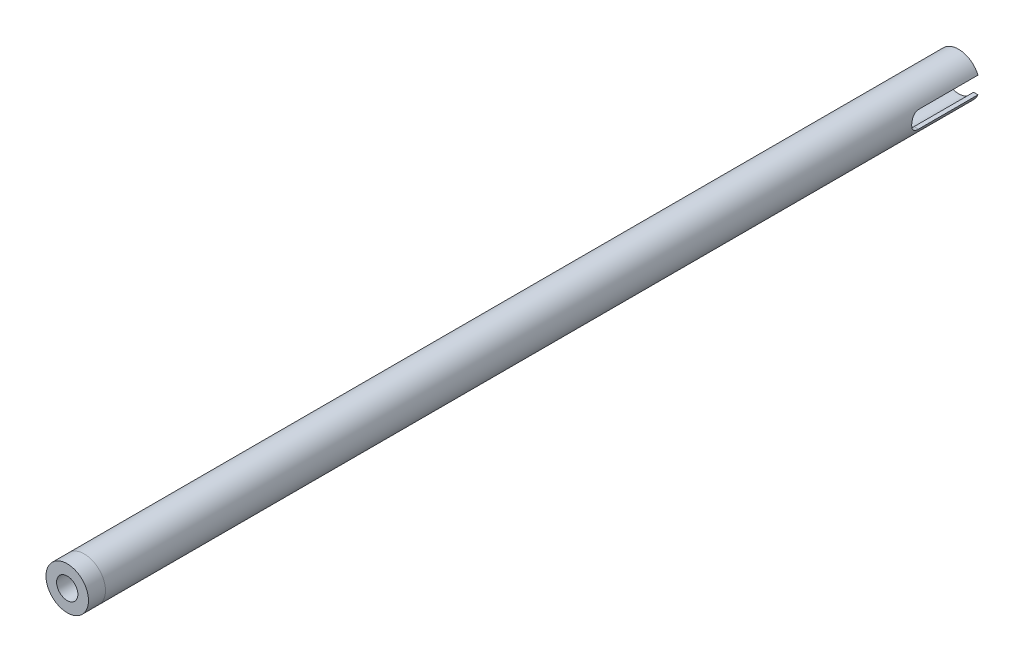
ISO-10303-21;
HEADER;
FILE_DESCRIPTION(('STEP AP214'),'2;1');
FILE_NAME('part.step','',(''),(''),'','','');
FILE_SCHEMA(('AUTOMOTIVE_DESIGN { 1 0 10303 214 1 1 1 1 }'));
ENDSEC;
DATA;
#1=APPLICATION_CONTEXT('core data for automotive mechanical design processes');
#2=APPLICATION_PROTOCOL_DEFINITION('international standard','automotive_design',2000,#1);
#3=PRODUCT_CONTEXT('',#1,'mechanical');
#4=PRODUCT('Part','Part','',(#3));
#5=PRODUCT_RELATED_PRODUCT_CATEGORY('part','',(#4));
#6=PRODUCT_DEFINITION_FORMATION('','',#4);
#7=PRODUCT_DEFINITION_CONTEXT('part definition',#1,'design');
#8=PRODUCT_DEFINITION('design','',#6,#7);
#9=PRODUCT_DEFINITION_SHAPE('','',#8);
#10=(LENGTH_UNIT() NAMED_UNIT(*) SI_UNIT(.MILLI.,.METRE.));
#11=(NAMED_UNIT(*) PLANE_ANGLE_UNIT() SI_UNIT($,.RADIAN.));
#12=(NAMED_UNIT(*) SI_UNIT($,.STERADIAN.) SOLID_ANGLE_UNIT());
#13=UNCERTAINTY_MEASURE_WITH_UNIT(LENGTH_MEASURE(1.E-05),#10,'distance_accuracy_value','');
#14=(GEOMETRIC_REPRESENTATION_CONTEXT(3) GLOBAL_UNCERTAINTY_ASSIGNED_CONTEXT((#13)) GLOBAL_UNIT_ASSIGNED_CONTEXT((#10,
#11,#12)) REPRESENTATION_CONTEXT('',''));
#15=CARTESIAN_POINT('',(0.,0.,0.));
#16=DIRECTION('',(0.,0.,1.));
#17=DIRECTION('',(1.,0.,0.));
#18=AXIS2_PLACEMENT_3D('',#15,#16,#17);
#19=CARTESIAN_POINT('',(0.,0.,-332.661725369318));
#20=DIRECTION('',(0.,0.,1.));
#21=DIRECTION('',(1.,0.,0.));
#22=AXIS2_PLACEMENT_3D('',#19,#20,#21);
#23=CYLINDRICAL_SURFACE('',#22,7.9375);
#24=CARTESIAN_POINT('',(0.,0.,-6.35));
#25=DIRECTION('',(0.,0.,1.));
#26=DIRECTION('',(1.,0.,0.));
#27=AXIS2_PLACEMENT_3D('',#24,#25,#26);
#28=CIRCLE('',#27,7.9375);
#29=CARTESIAN_POINT('',(7.9375,0.,-6.35));
#30=VERTEX_POINT('',#29);
#31=EDGE_CURVE('E167',#30,#30,#28,.T.);
#32=ORIENTED_EDGE('',*,*,#31,.F.);
#33=EDGE_LOOP('',(#32));
#34=FACE_BOUND('',#33,.T.);
#35=CARTESIAN_POINT('',(-7.2748389157424,3.175,-310.436725369318));
#36=CARTESIAN_POINT('',(-7.27482137043434,3.17501267173453,-310.351305253836));
#37=CARTESIAN_POINT('',(-7.27634297592672,3.17155313247793,-310.265894724273));
#38=CARTESIAN_POINT('',(-7.28233338484875,3.15778866907725,-310.095762719945));
#39=CARTESIAN_POINT('',(-7.28680106535325,3.14748635311323,-310.011040995086));
#40=CARTESIAN_POINT('',(-7.2985291631267,3.12019002880163,-309.843227295277));
#41=CARTESIAN_POINT('',(-7.30577831906487,3.10322299732752,-309.760130150518));
#42=CARTESIAN_POINT('',(-7.32282161153744,3.06278779397035,-309.595819048493));
#43=CARTESIAN_POINT('',(-7.33261590324725,3.03931922568674,-309.514605206379));
#44=CARTESIAN_POINT('',(-7.36535331460444,2.95952924342962,-309.274780383796));
#45=CARTESIAN_POINT('',(-7.39167595677839,2.89376893609239,-309.119655454993));
#46=CARTESIAN_POINT('',(-7.45033259991547,2.73920602658923,-308.822568028282));
#47=CARTESIAN_POINT('',(-7.48267254395243,2.65038060922872,-308.680618753064));
#48=CARTESIAN_POINT('',(-7.55175295441386,2.44684429809695,-308.405897983544));
#49=CARTESIAN_POINT('',(-7.58863404630154,2.33103943595689,-308.273970599032));
#50=CARTESIAN_POINT('',(-7.66147718953598,2.07914562663536,-308.0308077154));
#51=CARTESIAN_POINT('',(-7.69743902899202,1.94305205135848,-307.919576950473));
#52=CARTESIAN_POINT('',(-7.76611692840651,1.64778282664419,-307.716655750977));
#53=CARTESIAN_POINT('',(-7.79864638434712,1.48790317306356,-307.625921339573));
#54=CARTESIAN_POINT('',(-7.85502980346525,1.15369615984563,-307.473063786156));
#55=CARTESIAN_POINT('',(-7.87889360585224,0.979385463602722,-307.410908173538));
#56=CARTESIAN_POINT('',(-7.91022225039827,0.670405323433354,-307.330396529882));
#57=CARTESIAN_POINT('',(-7.92038443902171,0.537888188660439,-307.304718606473));
#58=CARTESIAN_POINT('',(-7.93061686811603,0.337231082382107,-307.278963523391));
#59=CARTESIAN_POINT('',(-7.93319257341971,0.269991647180298,-307.272505426111));
#60=CARTESIAN_POINT('',(-7.93663621925193,0.135173873369596,-307.263884408359));
#61=CARTESIAN_POINT('',(-7.93750363389236,0.0675954368175869,-307.261722810541));
#62=CARTESIAN_POINT('',(-7.9375,0.,-307.261725369318));
#63=B_SPLINE_CURVE_WITH_KNOTS('',3,(#35,#36,#37,#38,#39,#40,#41,#42,#43,#44,#45,#46,#47,#48,#49,
#50,#51,#52,#53,#54,#55,#56,#57,#58,#59,#60,#61,#62),.UNSPECIFIED.,.F.,.F.,(4,2,2,2,2,2,2,2,2,2,
2,2,2,4),(0.,0.256160797396612,0.512224013007058,0.767261264672238,1.02231406945471,
1.53142416248594,2.04103978047897,2.57679273649398,3.11266809162683,3.66991136029742,
4.22651992730645,4.63134321412666,4.8339937586662,5.03670667834028),.UNSPECIFIED.);
#64=CARTESIAN_POINT('',(-7.2748389157424,3.175,-310.436725369318));
#65=VERTEX_POINT('',#64);
#66=CARTESIAN_POINT('',(-7.9375,0.,-307.261725369318));
#67=VERTEX_POINT('',#66);
#68=EDGE_CURVE('E194',#65,#67,#63,.T.);
#69=ORIENTED_EDGE('',*,*,#68,.T.);
#70=CARTESIAN_POINT('',(-7.9375,0.,-307.261725369318));
#71=CARTESIAN_POINT('',(-7.93751279435796,-0.0856973243893185,-307.261713339149));
#72=CARTESIAN_POINT('',(-7.93611246860092,-0.171386675169291,-307.265194706621));
#73=CARTESIAN_POINT('',(-7.93058107051394,-0.342092796869088,-307.279050801956));
#74=CARTESIAN_POINT('',(-7.92645080745519,-0.427109759557717,-307.289423486939));
#75=CARTESIAN_POINT('',(-7.91557399086504,-0.595570690948319,-307.316920681006));
#76=CARTESIAN_POINT('',(-7.90883664469869,-0.67901912358001,-307.334021432279));
#77=CARTESIAN_POINT('',(-7.89293284658536,-0.844038966454646,-307.374788679753));
#78=CARTESIAN_POINT('',(-7.88376629739099,-0.925610301410303,-307.398455438809));
#79=CARTESIAN_POINT('',(-7.85297007832481,-1.16656173687588,-307.478963094508));
#80=CARTESIAN_POINT('',(-7.82802544143958,-1.32244720282989,-307.545355727385));
#81=CARTESIAN_POINT('',(-7.77174407779742,-1.62081902572888,-307.701401131378));
#82=CARTESIAN_POINT('',(-7.74040257287306,-1.7632952496653,-307.791071303441));
#83=CARTESIAN_POINT('',(-7.67287736621953,-2.03755465224644,-307.995524910956));
#84=CARTESIAN_POINT('',(-7.63654472176442,-2.16862853615059,-308.111211767688));
#85=CARTESIAN_POINT('',(-7.56380976030912,-2.41011022612819,-308.362505869397));
#86=CARTESIAN_POINT('',(-7.52740741976911,-2.52050895891189,-308.498121813879));
#87=CARTESIAN_POINT('',(-7.45683282624284,-2.72240939900242,-308.792820308746));
#88=CARTESIAN_POINT('',(-7.4228346735038,-2.81283701743189,-308.952684298661));
#89=CARTESIAN_POINT('',(-7.3633362219632,-2.96511894168388,-309.286810263457));
#90=CARTESIAN_POINT('',(-7.33782422493328,-3.02701262758154,-309.461052001217));
#91=CARTESIAN_POINT('',(-7.30424985403508,-3.10695047193342,-309.769355725868));
#92=CARTESIAN_POINT('',(-7.29331360019113,-3.13238569878909,-309.901214486754));
#93=CARTESIAN_POINT('',(-7.28227977674291,-3.15790858319001,-310.100931368448));
#94=CARTESIAN_POINT('',(-7.27949685702346,-3.16431127275807,-310.167879659208));
#95=CARTESIAN_POINT('',(-7.27577355567174,-3.17285909036155,-310.302121217074));
#96=CARTESIAN_POINT('',(-7.27483380475762,-3.1750027609968,-310.369414594372));
#97=CARTESIAN_POINT('',(-7.2748389157424,-3.175,-310.436725369318));
#98=B_SPLINE_CURVE_WITH_KNOTS('',3,(#70,#71,#72,#73,#74,#75,#76,#77,#78,#79,#80,#81,#82,#83,#84,
#85,#86,#87,#88,#89,#90,#91,#92,#93,#94,#95,#96,#97),.UNSPECIFIED.,.F.,.F.,(4,2,2,2,2,2,2,2,2,2,
2,2,2,4),(0.,0.256996432008007,0.513916713336978,0.769937797705386,1.02596913282157,
1.53722547809954,2.04886511530059,2.58219314099272,3.11575467201799,3.67332953074261,
4.2301325519037,4.63306130520181,4.8348500382744,5.03670780985612),.UNSPECIFIED.);
#99=CARTESIAN_POINT('',(-7.2748389157424,-3.175,-310.436725369318));
#100=VERTEX_POINT('',#99);
#101=EDGE_CURVE('E146',#67,#100,#98,.T.);
#102=ORIENTED_EDGE('',*,*,#101,.T.);
#103=DIRECTION('',(0.,0.,-1.));
#104=VECTOR('',#103,1.);
#105=CARTESIAN_POINT('',(-7.2748389157424,-3.175,-307.261725369318));
#106=LINE('',#105,#104);
#107=CARTESIAN_POINT('',(-7.2748389157424,-3.175,-332.661725369318));
#108=VERTEX_POINT('',#107);
#109=EDGE_CURVE('E141',#100,#108,#106,.T.);
#110=ORIENTED_EDGE('',*,*,#109,.T.);
#111=CARTESIAN_POINT('',(0.,0.,-332.661725369318));
#112=DIRECTION('',(0.,0.,1.));
#113=DIRECTION('',(1.,0.,0.));
#114=AXIS2_PLACEMENT_3D('',#111,#112,#113);
#115=CIRCLE('',#114,7.9375);
#116=CARTESIAN_POINT('',(7.2748389157424,-3.175,-332.661725369318));
#117=VERTEX_POINT('',#116);
#118=EDGE_CURVE('E144',#108,#117,#115,.T.);
#119=ORIENTED_EDGE('',*,*,#118,.T.);
#120=DIRECTION('',(0.,0.,-1.));
#121=VECTOR('',#120,1.);
#122=CARTESIAN_POINT('',(7.2748389157424,-3.175,-307.261725369318));
#123=LINE('',#122,#121);
#124=CARTESIAN_POINT('',(7.2748389157424,-3.175,-310.436725369318));
#125=VERTEX_POINT('',#124);
#126=EDGE_CURVE('E427',#125,#117,#123,.T.);
#127=ORIENTED_EDGE('',*,*,#126,.F.);
#128=CARTESIAN_POINT('',(7.2748389157424,-3.175,-310.436725369318));
#129=CARTESIAN_POINT('',(7.27482137043434,-3.17501267173453,-310.351305253836));
#130=CARTESIAN_POINT('',(7.27634297592672,-3.17155313247793,-310.265894724273));
#131=CARTESIAN_POINT('',(7.28233338484875,-3.15778866907725,-310.095762719945));
#132=CARTESIAN_POINT('',(7.28680106535325,-3.14748635311323,-310.011040995086));
#133=CARTESIAN_POINT('',(7.2985291631267,-3.12019002880163,-309.843227295277));
#134=CARTESIAN_POINT('',(7.30577831906487,-3.10322299732752,-309.760130150518));
#135=CARTESIAN_POINT('',(7.32282161153744,-3.06278779397035,-309.595819048493));
#136=CARTESIAN_POINT('',(7.33261590324725,-3.03931922568674,-309.514605206379));
#137=CARTESIAN_POINT('',(7.36535331460444,-2.95952924342962,-309.274780383796));
#138=CARTESIAN_POINT('',(7.39167595677839,-2.89376893609239,-309.119655454993));
#139=CARTESIAN_POINT('',(7.45033259991547,-2.73920602658923,-308.822568028282));
#140=CARTESIAN_POINT('',(7.48267254395243,-2.65038060922872,-308.680618753064));
#141=CARTESIAN_POINT('',(7.55175295441386,-2.44684429809695,-308.405897983544));
#142=CARTESIAN_POINT('',(7.58863404630154,-2.33103943595689,-308.273970599032));
#143=CARTESIAN_POINT('',(7.66147718953598,-2.07914562663536,-308.0308077154));
#144=CARTESIAN_POINT('',(7.69743902899202,-1.94305205135848,-307.919576950473));
#145=CARTESIAN_POINT('',(7.76611692840651,-1.64778282664419,-307.716655750977));
#146=CARTESIAN_POINT('',(7.79864638434712,-1.48790317306356,-307.625921339573));
#147=CARTESIAN_POINT('',(7.85502980346525,-1.15369615984563,-307.473063786156));
#148=CARTESIAN_POINT('',(7.87889360585224,-0.979385463602722,-307.410908173538));
#149=CARTESIAN_POINT('',(7.91022225039827,-0.670405323433354,-307.330396529882));
#150=CARTESIAN_POINT('',(7.92038443902171,-0.537888188660439,-307.304718606473));
#151=CARTESIAN_POINT('',(7.93061686811603,-0.337231082382107,-307.278963523391));
#152=CARTESIAN_POINT('',(7.93319257341971,-0.269991647180298,-307.272505426111));
#153=CARTESIAN_POINT('',(7.93663621925193,-0.135173873369596,-307.263884408359));
#154=CARTESIAN_POINT('',(7.93750363389236,-0.0675954368175869,-307.261722810541));
#155=CARTESIAN_POINT('',(7.9375,0.,-307.261725369318));
#156=B_SPLINE_CURVE_WITH_KNOTS('',3,(#128,#129,#130,#131,#132,#133,#134,#135,#136,#137,#138,
#139,#140,#141,#142,#143,#144,#145,#146,#147,#148,#149,#150,#151,#152,#153,#154,#155),
.UNSPECIFIED.,.F.,.F.,(4,2,2,2,2,2,2,2,2,2,2,2,2,4),(0.,0.256160797396612,0.512224013007058,
0.767261264672238,1.02231406945471,1.53142416248594,2.04103978047897,2.57679273649398,
3.11266809162683,3.66991136029742,4.22651992730645,4.63134321412666,4.8339937586662,
5.03670667834028),.UNSPECIFIED.);
#157=CARTESIAN_POINT('',(7.9375,0.,-307.261725369318));
#158=VERTEX_POINT('',#157);
#159=EDGE_CURVE('E87',#125,#158,#156,.T.);
#160=ORIENTED_EDGE('',*,*,#159,.T.);
#161=CARTESIAN_POINT('',(7.9375,0.,-307.261725369318));
#162=CARTESIAN_POINT('',(7.93751279435796,0.0856973243893185,-307.261713339149));
#163=CARTESIAN_POINT('',(7.93611246860092,0.171386675169291,-307.265194706621));
#164=CARTESIAN_POINT('',(7.93058107051394,0.342092796869088,-307.279050801956));
#165=CARTESIAN_POINT('',(7.92645080745519,0.427109759557717,-307.289423486939));
#166=CARTESIAN_POINT('',(7.91557399086504,0.595570690948319,-307.316920681006));
#167=CARTESIAN_POINT('',(7.90883664469869,0.67901912358001,-307.334021432279));
#168=CARTESIAN_POINT('',(7.89293284658536,0.844038966454646,-307.374788679753));
#169=CARTESIAN_POINT('',(7.88376629739099,0.925610301410303,-307.398455438809));
#170=CARTESIAN_POINT('',(7.85297007832481,1.16656173687588,-307.478963094508));
#171=CARTESIAN_POINT('',(7.82802544143958,1.32244720282989,-307.545355727385));
#172=CARTESIAN_POINT('',(7.77174407779742,1.62081902572888,-307.701401131378));
#173=CARTESIAN_POINT('',(7.74040257287306,1.7632952496653,-307.791071303441));
#174=CARTESIAN_POINT('',(7.67287736621953,2.03755465224644,-307.995524910956));
#175=CARTESIAN_POINT('',(7.63654472176442,2.16862853615059,-308.111211767688));
#176=CARTESIAN_POINT('',(7.56380976030912,2.41011022612819,-308.362505869397));
#177=CARTESIAN_POINT('',(7.52740741976911,2.52050895891189,-308.498121813879));
#178=CARTESIAN_POINT('',(7.45683282624284,2.72240939900242,-308.792820308746));
#179=CARTESIAN_POINT('',(7.4228346735038,2.81283701743189,-308.952684298661));
#180=CARTESIAN_POINT('',(7.3633362219632,2.96511894168388,-309.286810263457));
#181=CARTESIAN_POINT('',(7.33782422493328,3.02701262758154,-309.461052001217));
#182=CARTESIAN_POINT('',(7.30424985403508,3.10695047193342,-309.769355725868));
#183=CARTESIAN_POINT('',(7.29331360019113,3.13238569878909,-309.901214486754));
#184=CARTESIAN_POINT('',(7.28227977674291,3.15790858319001,-310.100931368448));
#185=CARTESIAN_POINT('',(7.27949685702346,3.16431127275807,-310.167879659208));
#186=CARTESIAN_POINT('',(7.27577355567174,3.17285909036155,-310.302121217074));
#187=CARTESIAN_POINT('',(7.27483380475762,3.1750027609968,-310.369414594372));
#188=CARTESIAN_POINT('',(7.2748389157424,3.175,-310.436725369318));
#189=B_SPLINE_CURVE_WITH_KNOTS('',3,(#161,#162,#163,#164,#165,#166,#167,#168,#169,#170,#171,
#172,#173,#174,#175,#176,#177,#178,#179,#180,#181,#182,#183,#184,#185,#186,#187,#188),
.UNSPECIFIED.,.F.,.F.,(4,2,2,2,2,2,2,2,2,2,2,2,2,4),(0.,0.256996432008007,0.513916713336978,
0.769937797705386,1.02596913282157,1.53722547809954,2.04886511530059,2.58219314099272,
3.11575467201799,3.67332953074261,4.2301325519037,4.63306130520181,4.8348500382744,
5.03670780985612),.UNSPECIFIED.);
#190=CARTESIAN_POINT('',(7.2748389157424,3.175,-310.436725369318));
#191=VERTEX_POINT('',#190);
#192=EDGE_CURVE('E73',#158,#191,#189,.T.);
#193=ORIENTED_EDGE('',*,*,#192,.T.);
#194=DIRECTION('',(0.,0.,-1.));
#195=VECTOR('',#194,1.);
#196=CARTESIAN_POINT('',(7.2748389157424,3.175,-307.261725369318));
#197=LINE('',#196,#195);
#198=CARTESIAN_POINT('',(7.2748389157424,3.175,-332.661725369318));
#199=VERTEX_POINT('',#198);
#200=EDGE_CURVE('E160',#191,#199,#197,.T.);
#201=ORIENTED_EDGE('',*,*,#200,.T.);
#202=CARTESIAN_POINT('',(-7.2748389157424,3.175,-332.661725369318));
#203=VERTEX_POINT('',#202);
#204=EDGE_CURVE('E166',#199,#203,#115,.T.);
#205=ORIENTED_EDGE('',*,*,#204,.T.);
#206=DIRECTION('',(0.,0.,-1.));
#207=VECTOR('',#206,1.);
#208=CARTESIAN_POINT('',(-7.2748389157424,3.175,-307.261725369318));
#209=LINE('',#208,#207);
#210=EDGE_CURVE('E420',#65,#203,#209,.T.);
#211=ORIENTED_EDGE('',*,*,#210,.F.);
#212=EDGE_LOOP('',(#69,#102,#110,#119,#127,#160,#193,#201,#205,#211));
#213=FACE_BOUND('',#212,.T.);
#214=ADVANCED_FACE('F63',(#34,#213),#23,.T.);
#215=CARTESIAN_POINT('',(0.,0.,-332.661725369318));
#216=DIRECTION('',(0.,0.,1.));
#217=DIRECTION('',(1.,0.,0.));
#218=AXIS2_PLACEMENT_3D('',#215,#216,#217);
#219=PLANE('',#218);
#220=DIRECTION('',(1.,0.,0.));
#221=VECTOR('',#220,1.);
#222=CARTESIAN_POINT('',(0.,-3.175,-332.661725369318));
#223=LINE('',#222,#221);
#224=CARTESIAN_POINT('',(-5.63085690548073,-3.175,-332.661725369318));
#225=VERTEX_POINT('',#224);
#226=EDGE_CURVE('E153',#108,#225,#223,.T.);
#227=ORIENTED_EDGE('',*,*,#226,.T.);
#228=CARTESIAN_POINT('',(0.,0.,-332.661725369318));
#229=DIRECTION('',(0.,0.,1.));
#230=DIRECTION('',(1.,0.,0.));
#231=AXIS2_PLACEMENT_3D('',#228,#229,#230);
#232=CIRCLE('',#231,6.4643);
#233=CARTESIAN_POINT('',(5.63085690548073,-3.175,-332.661725369318));
#234=VERTEX_POINT('',#233);
#235=EDGE_CURVE('E275',#225,#234,#232,.T.);
#236=ORIENTED_EDGE('',*,*,#235,.T.);
#237=DIRECTION('',(1.,0.,0.));
#238=VECTOR('',#237,1.);
#239=CARTESIAN_POINT('',(0.,-3.175,-332.661725369318));
#240=LINE('',#239,#238);
#241=EDGE_CURVE('E165',#234,#117,#240,.T.);
#242=ORIENTED_EDGE('',*,*,#241,.T.);
#243=ORIENTED_EDGE('',*,*,#118,.F.);
#244=EDGE_LOOP('',(#227,#236,#242,#243));
#245=FACE_BOUND('',#244,.T.);
#246=ADVANCED_FACE('F163',(#245),#219,.F.);
#247=CARTESIAN_POINT('',(0.,0.,-332.661725369318));
#248=DIRECTION('',(0.,0.,1.));
#249=DIRECTION('',(1.,0.,0.));
#250=AXIS2_PLACEMENT_3D('',#247,#248,#249);
#251=CYLINDRICAL_SURFACE('',#250,6.4643);
#252=CARTESIAN_POINT('',(0.,0.,-6.35));
#253=DIRECTION('',(0.,0.,1.));
#254=DIRECTION('',(1.,0.,0.));
#255=AXIS2_PLACEMENT_3D('',#252,#253,#254);
#256=CIRCLE('',#255,6.4643);
#257=CARTESIAN_POINT('',(6.4643,0.,-6.35));
#258=VERTEX_POINT('',#257);
#259=EDGE_CURVE('E149',#258,#258,#256,.T.);
#260=ORIENTED_EDGE('',*,*,#259,.T.);
#261=EDGE_LOOP('',(#260));
#262=FACE_BOUND('',#261,.T.);
#263=DIRECTION('',(0.,0.,-1.));
#264=VECTOR('',#263,1.);
#265=CARTESIAN_POINT('',(-5.63085690548073,-3.175,-307.261725369318));
#266=LINE('',#265,#264);
#267=CARTESIAN_POINT('',(-5.63085690548073,-3.175,-310.436725369318));
#268=VERTEX_POINT('',#267);
#269=EDGE_CURVE('E150',#268,#225,#266,.T.);
#270=ORIENTED_EDGE('',*,*,#269,.F.);
#271=CARTESIAN_POINT('',(-5.63085690548073,-3.175,-310.436725369318));
#272=CARTESIAN_POINT('',(-5.63083313994649,-3.17501475983035,-310.353348534598));
#273=CARTESIAN_POINT('',(-5.63270815771784,-3.17171623434453,-310.269984859429));
#274=CARTESIAN_POINT('',(-5.64007695954704,-3.15860868668088,-310.103979717333));
#275=CARTESIAN_POINT('',(-5.645568609108,-3.14880350463522,-310.021337853534));
#276=CARTESIAN_POINT('',(-5.65995160356269,-3.12287177657854,-309.857834588864));
#277=CARTESIAN_POINT('',(-5.66882360641349,-3.10678118209035,-309.776965776684));
#278=CARTESIAN_POINT('',(-5.68964253084949,-3.06848763641647,-309.617108396957));
#279=CARTESIAN_POINT('',(-5.70158978762268,-3.0462840189221,-309.538120035397));
#280=CARTESIAN_POINT('',(-5.74141867016874,-2.9709479042579,-309.305061789436));
#281=CARTESIAN_POINT('',(-5.77333273238342,-2.90901346570841,-309.154425248802));
#282=CARTESIAN_POINT('',(-5.84425759514897,-2.763754188191,-308.865570143967));
#283=CARTESIAN_POINT('',(-5.88327925344641,-2.68039654138926,-308.727371068904));
#284=CARTESIAN_POINT('',(-5.96775435279507,-2.48697819565355,-308.455430030665));
#285=CARTESIAN_POINT('',(-6.01347229172614,-2.37533204038057,-308.322895224316));
#286=CARTESIAN_POINT('',(-6.10404593063631,-2.13182339161096,-308.077519641238));
#287=CARTESIAN_POINT('',(-6.14890136897125,-1.99995486913048,-307.964684759259));
#288=CARTESIAN_POINT('',(-6.23619220514827,-1.70925564842441,-307.754701375339));
#289=CARTESIAN_POINT('',(-6.27828027392068,-1.54922894444793,-307.65905109961));
#290=CARTESIAN_POINT('',(-6.351789494002,-1.21302302470908,-307.496667194393));
#291=CARTESIAN_POINT('',(-6.3832266631188,-1.03686857473503,-307.429890100589));
#292=CARTESIAN_POINT('',(-6.42590822780063,-0.717171909263578,-307.340457453281));
#293=CARTESIAN_POINT('',(-6.4401838278065,-0.575906031157537,-307.311069208359));
#294=CARTESIAN_POINT('',(-6.45458743188517,-0.361448476439118,-307.281536488697));
#295=CARTESIAN_POINT('',(-6.45822048728408,-0.289432204318672,-307.274117043936));
#296=CARTESIAN_POINT('',(-6.46308007773031,-0.144952050292043,-307.264208571776));
#297=CARTESIAN_POINT('',(-6.46430565210199,-0.072488001271515,-307.26172151258));
#298=CARTESIAN_POINT('',(-6.4643,0.,-307.261725369318));
#299=B_SPLINE_CURVE_WITH_KNOTS('',3,(#271,#272,#273,#274,#275,#276,#277,#278,#279,#280,#281,
#282,#283,#284,#285,#286,#287,#288,#289,#290,#291,#292,#293,#294,#295,#296,#297,#298),
.UNSPECIFIED.,.F.,.F.,(4,2,2,2,2,2,2,2,2,2,2,2,2,4),(0.,0.250022608278555,0.499897788003946,
0.748364171658939,0.996857648438736,1.49241740389683,1.9887406369739,2.52413245916958,
3.05968421153491,3.63008006190818,4.19961425046545,4.63293550793411,4.85021333970384,
5.06757785591817),.UNSPECIFIED.);
#300=CARTESIAN_POINT('',(-6.4643,0.,-307.261725369318));
#301=VERTEX_POINT('',#300);
#302=EDGE_CURVE('E221',#268,#301,#299,.T.);
#303=ORIENTED_EDGE('',*,*,#302,.T.);
#304=CARTESIAN_POINT('',(-6.4643,0.,-307.261725369318));
#305=CARTESIAN_POINT('',(-6.46431471784482,0.0839947643435499,-307.261712025192));
#306=CARTESIAN_POINT('',(-6.46266329267846,0.167980128010398,-307.26505812456));
#307=CARTESIAN_POINT('',(-6.45613851930725,0.335267070847885,-307.278365578164));
#308=CARTESIAN_POINT('',(-6.45126643524264,0.418568905327645,-307.288324336872));
#309=CARTESIAN_POINT('',(-6.4384393661228,0.583520093709583,-307.314694379341));
#310=CARTESIAN_POINT('',(-6.43049830091841,0.665175181914776,-307.331076533589));
#311=CARTESIAN_POINT('',(-6.41174605062734,0.826621713408832,-307.370094073343));
#312=CARTESIAN_POINT('',(-6.40093469346325,0.906413044651103,-307.392729833763));
#313=CARTESIAN_POINT('',(-6.3645999533627,1.14200454475575,-307.469629397855));
#314=CARTESIAN_POINT('',(-6.33514826225986,1.29435730209625,-307.532940031038));
#315=CARTESIAN_POINT('',(-6.26847721301058,1.5861501237047,-307.681431530868));
#316=CARTESIAN_POINT('',(-6.23125016174678,1.7255772002446,-307.766634077234));
#317=CARTESIAN_POINT('',(-6.14993667819984,1.99664965861336,-307.962148023363));
#318=CARTESIAN_POINT('',(-6.10557667432164,2.12736555519219,-308.073634883014));
#319=CARTESIAN_POINT('',(-6.01591119010693,2.36910305567939,-308.316037306196));
#320=CARTESIAN_POINT('',(-5.97060501254448,2.4801095192896,-308.446967665182));
#321=CARTESIAN_POINT('',(-5.88028635793905,2.68759195973766,-308.736290003925));
#322=CARTESIAN_POINT('',(-5.83554983812279,2.78235777578918,-308.896004106578));
#323=CARTESIAN_POINT('',(-5.75613746809778,2.94315382396594,-309.231355351154));
#324=CARTESIAN_POINT('',(-5.72144095718824,3.00924320962384,-309.406958803008));
#325=CARTESIAN_POINT('',(-5.67404956693615,3.09744900867387,-309.724963104694));
#326=CARTESIAN_POINT('',(-5.65804978215016,3.12636521602239,-309.864987794636));
#327=CARTESIAN_POINT('',(-5.64184153899281,3.1554574998571,-310.077736093246));
#328=CARTESIAN_POINT('',(-5.63773701667688,3.16277482388528,-310.149245981351));
#329=CARTESIAN_POINT('',(-5.63223913004552,3.17254960488947,-310.292737043122));
#330=CARTESIAN_POINT('',(-5.6308471601211,3.17500456237039,-310.364718440103));
#331=CARTESIAN_POINT('',(-5.63085690548073,3.175,-310.436725369318));
#332=B_SPLINE_CURVE_WITH_KNOTS('',3,(#304,#305,#306,#307,#308,#309,#310,#311,#312,#313,#314,
#315,#316,#317,#318,#319,#320,#321,#322,#323,#324,#325,#326,#327,#328,#329,#330,#331),
.UNSPECIFIED.,.F.,.F.,(4,2,2,2,2,2,2,2,2,2,2,2,2,4),(0.,0.251885801688016,0.503672794384369,
0.754330922106977,1.00500408047846,1.50534146760879,2.00617626510683,2.53624961383851,
3.06672840649523,3.63692439554961,4.20593853113138,4.63586569132644,4.85167139809474,
5.06758801082739),.UNSPECIFIED.);
#333=CARTESIAN_POINT('',(-5.63085690548073,3.175,-310.436725369318));
#334=VERTEX_POINT('',#333);
#335=EDGE_CURVE('E186',#301,#334,#332,.T.);
#336=ORIENTED_EDGE('',*,*,#335,.T.);
#337=DIRECTION('',(0.,0.,-1.));
#338=VECTOR('',#337,1.);
#339=CARTESIAN_POINT('',(-5.63085690548073,3.175,-307.261725369318));
#340=LINE('',#339,#338);
#341=CARTESIAN_POINT('',(-5.63085690548073,3.175,-332.661725369318));
#342=VERTEX_POINT('',#341);
#343=EDGE_CURVE('E417',#334,#342,#340,.T.);
#344=ORIENTED_EDGE('',*,*,#343,.T.);
#345=CARTESIAN_POINT('',(5.63085690548073,3.175,-332.661725369318));
#346=VERTEX_POINT('',#345);
#347=EDGE_CURVE('E172',#346,#342,#232,.T.);
#348=ORIENTED_EDGE('',*,*,#347,.F.);
#349=DIRECTION('',(0.,0.,-1.));
#350=VECTOR('',#349,1.);
#351=CARTESIAN_POINT('',(5.63085690548073,3.175,-307.261725369318));
#352=LINE('',#351,#350);
#353=CARTESIAN_POINT('',(5.63085690548073,3.175,-310.436725369318));
#354=VERTEX_POINT('',#353);
#355=EDGE_CURVE('E269',#354,#346,#352,.T.);
#356=ORIENTED_EDGE('',*,*,#355,.F.);
#357=CARTESIAN_POINT('',(5.63085690548073,3.175,-310.436725369318));
#358=CARTESIAN_POINT('',(5.63083313994649,3.17501475983035,-310.353348534598));
#359=CARTESIAN_POINT('',(5.63270815771784,3.17171623434453,-310.269984859429));
#360=CARTESIAN_POINT('',(5.64007695954704,3.15860868668088,-310.103979717333));
#361=CARTESIAN_POINT('',(5.645568609108,3.14880350463522,-310.021337853534));
#362=CARTESIAN_POINT('',(5.65995160356269,3.12287177657854,-309.857834588864));
#363=CARTESIAN_POINT('',(5.66882360641349,3.10678118209035,-309.776965776684));
#364=CARTESIAN_POINT('',(5.68964253084949,3.06848763641647,-309.617108396957));
#365=CARTESIAN_POINT('',(5.70158978762268,3.0462840189221,-309.538120035397));
#366=CARTESIAN_POINT('',(5.74141867016874,2.9709479042579,-309.305061789436));
#367=CARTESIAN_POINT('',(5.77333273238342,2.90901346570841,-309.154425248802));
#368=CARTESIAN_POINT('',(5.84425759514897,2.763754188191,-308.865570143967));
#369=CARTESIAN_POINT('',(5.88327925344641,2.68039654138926,-308.727371068904));
#370=CARTESIAN_POINT('',(5.96775435279507,2.48697819565355,-308.455430030665));
#371=CARTESIAN_POINT('',(6.01347229172614,2.37533204038057,-308.322895224316));
#372=CARTESIAN_POINT('',(6.10404593063631,2.13182339161096,-308.077519641238));
#373=CARTESIAN_POINT('',(6.14890136897125,1.99995486913048,-307.964684759259));
#374=CARTESIAN_POINT('',(6.23619220514827,1.70925564842441,-307.754701375339));
#375=CARTESIAN_POINT('',(6.27828027392068,1.54922894444793,-307.65905109961));
#376=CARTESIAN_POINT('',(6.351789494002,1.21302302470908,-307.496667194393));
#377=CARTESIAN_POINT('',(6.3832266631188,1.03686857473503,-307.429890100589));
#378=CARTESIAN_POINT('',(6.42590822780063,0.717171909263578,-307.340457453281));
#379=CARTESIAN_POINT('',(6.4401838278065,0.575906031157537,-307.311069208359));
#380=CARTESIAN_POINT('',(6.45458743188517,0.361448476439118,-307.281536488697));
#381=CARTESIAN_POINT('',(6.45822048728408,0.289432204318672,-307.274117043936));
#382=CARTESIAN_POINT('',(6.46308007773031,0.144952050292043,-307.264208571776));
#383=CARTESIAN_POINT('',(6.46430565210199,0.072488001271515,-307.26172151258));
#384=CARTESIAN_POINT('',(6.4643,0.,-307.261725369318));
#385=B_SPLINE_CURVE_WITH_KNOTS('',3,(#357,#358,#359,#360,#361,#362,#363,#364,#365,#366,#367,
#368,#369,#370,#371,#372,#373,#374,#375,#376,#377,#378,#379,#380,#381,#382,#383,#384),
.UNSPECIFIED.,.F.,.F.,(4,2,2,2,2,2,2,2,2,2,2,2,2,4),(0.,0.250022608278555,0.499897788003946,
0.748364171658939,0.996857648438736,1.49241740389683,1.9887406369739,2.52413245916958,
3.05968421153491,3.63008006190818,4.19961425046545,4.63293550793411,4.85021333970384,
5.06757785591817),.UNSPECIFIED.);
#386=CARTESIAN_POINT('',(6.4643,0.,-307.261725369318));
#387=VERTEX_POINT('',#386);
#388=EDGE_CURVE('E13',#354,#387,#385,.T.);
#389=ORIENTED_EDGE('',*,*,#388,.T.);
#390=CARTESIAN_POINT('',(6.4643,0.,-307.261725369318));
#391=CARTESIAN_POINT('',(6.46431471784482,-0.0839947643435499,-307.261712025192));
#392=CARTESIAN_POINT('',(6.46266329267846,-0.167980128010398,-307.26505812456));
#393=CARTESIAN_POINT('',(6.45613851930725,-0.335267070847885,-307.278365578164));
#394=CARTESIAN_POINT('',(6.45126643524264,-0.418568905327645,-307.288324336872));
#395=CARTESIAN_POINT('',(6.4384393661228,-0.583520093709583,-307.314694379341));
#396=CARTESIAN_POINT('',(6.43049830091841,-0.665175181914776,-307.331076533589));
#397=CARTESIAN_POINT('',(6.41174605062734,-0.826621713408832,-307.370094073343));
#398=CARTESIAN_POINT('',(6.40093469346325,-0.906413044651103,-307.392729833763));
#399=CARTESIAN_POINT('',(6.3645999533627,-1.14200454475575,-307.469629397855));
#400=CARTESIAN_POINT('',(6.33514826225986,-1.29435730209625,-307.532940031038));
#401=CARTESIAN_POINT('',(6.26847721301058,-1.5861501237047,-307.681431530868));
#402=CARTESIAN_POINT('',(6.23125016174678,-1.7255772002446,-307.766634077234));
#403=CARTESIAN_POINT('',(6.14993667819984,-1.99664965861336,-307.962148023363));
#404=CARTESIAN_POINT('',(6.10557667432164,-2.12736555519219,-308.073634883014));
#405=CARTESIAN_POINT('',(6.01591119010693,-2.36910305567939,-308.316037306196));
#406=CARTESIAN_POINT('',(5.97060501254448,-2.4801095192896,-308.446967665182));
#407=CARTESIAN_POINT('',(5.88028635793905,-2.68759195973766,-308.736290003925));
#408=CARTESIAN_POINT('',(5.83554983812279,-2.78235777578918,-308.896004106578));
#409=CARTESIAN_POINT('',(5.75613746809778,-2.94315382396594,-309.231355351154));
#410=CARTESIAN_POINT('',(5.72144095718824,-3.00924320962384,-309.406958803008));
#411=CARTESIAN_POINT('',(5.67404956693615,-3.09744900867387,-309.724963104694));
#412=CARTESIAN_POINT('',(5.65804978215016,-3.12636521602239,-309.864987794636));
#413=CARTESIAN_POINT('',(5.64184153899281,-3.1554574998571,-310.077736093246));
#414=CARTESIAN_POINT('',(5.63773701667688,-3.16277482388528,-310.149245981351));
#415=CARTESIAN_POINT('',(5.63223913004552,-3.17254960488947,-310.292737043122));
#416=CARTESIAN_POINT('',(5.6308471601211,-3.17500456237039,-310.364718440103));
#417=CARTESIAN_POINT('',(5.63085690548073,-3.175,-310.436725369318));
#418=B_SPLINE_CURVE_WITH_KNOTS('',3,(#390,#391,#392,#393,#394,#395,#396,#397,#398,#399,#400,
#401,#402,#403,#404,#405,#406,#407,#408,#409,#410,#411,#412,#413,#414,#415,#416,#417),
.UNSPECIFIED.,.F.,.F.,(4,2,2,2,2,2,2,2,2,2,2,2,2,4),(0.,0.251885801688016,0.503672794384369,
0.754330922106977,1.00500408047846,1.50534146760879,2.00617626510683,2.53624961383851,
3.06672840649523,3.63692439554961,4.20593853113138,4.63586569132644,4.85167139809474,
5.06758801082739),.UNSPECIFIED.);
#419=CARTESIAN_POINT('',(5.63085690548073,-3.175,-310.436725369318));
#420=VERTEX_POINT('',#419);
#421=EDGE_CURVE('E237',#387,#420,#418,.T.);
#422=ORIENTED_EDGE('',*,*,#421,.T.);
#423=DIRECTION('',(0.,0.,-1.));
#424=VECTOR('',#423,1.);
#425=CARTESIAN_POINT('',(5.63085690548073,-3.175,-307.261725369318));
#426=LINE('',#425,#424);
#427=EDGE_CURVE('E271',#420,#234,#426,.T.);
#428=ORIENTED_EDGE('',*,*,#427,.T.);
#429=ORIENTED_EDGE('',*,*,#235,.F.);
#430=EDGE_LOOP('',(#270,#303,#336,#344,#348,#356,#389,#422,#428,#429));
#431=FACE_BOUND('',#430,.T.);
#432=ADVANCED_FACE('F201',(#262,#431),#251,.F.);
#433=ORIENTED_EDGE('',*,*,#347,.T.);
#434=DIRECTION('',(1.,0.,0.));
#435=VECTOR('',#434,1.);
#436=CARTESIAN_POINT('',(0.,3.175,-332.661725369318));
#437=LINE('',#436,#435);
#438=EDGE_CURVE('E159',#203,#342,#437,.T.);
#439=ORIENTED_EDGE('',*,*,#438,.F.);
#440=ORIENTED_EDGE('',*,*,#204,.F.);
#441=DIRECTION('',(1.,0.,0.));
#442=VECTOR('',#441,1.);
#443=CARTESIAN_POINT('',(0.,3.175,-332.661725369318));
#444=LINE('',#443,#442);
#445=EDGE_CURVE('E253',#346,#199,#444,.T.);
#446=ORIENTED_EDGE('',*,*,#445,.F.);
#447=EDGE_LOOP('',(#433,#439,#440,#446));
#448=FACE_BOUND('',#447,.T.);
#449=ADVANCED_FACE('F286',(#448),#219,.F.);
#450=CARTESIAN_POINT('',(0.,0.,-6.35));
#451=DIRECTION('',(0.,0.,1.));
#452=DIRECTION('',(1.,0.,0.));
#453=AXIS2_PLACEMENT_3D('',#450,#451,#452);
#454=PLANE('',#453);
#455=ORIENTED_EDGE('',*,*,#259,.F.);
#456=EDGE_LOOP('',(#455));
#457=FACE_BOUND('',#456,.T.);
#458=ORIENTED_EDGE('',*,*,#31,.T.);
#459=EDGE_LOOP('',(#458));
#460=FACE_BOUND('',#459,.T.);
#461=ADVANCED_FACE('F283',(#457,#460),#454,.T.);
#462=CARTESIAN_POINT('',(0.,3.175,-307.261725369318));
#463=DIRECTION('',(0.,1.,0.));
#464=DIRECTION('',(0.,0.,1.));
#465=AXIS2_PLACEMENT_3D('',#462,#463,#464);
#466=PLANE('',#465);
#467=ORIENTED_EDGE('',*,*,#200,.F.);
#468=DIRECTION('',(1.,0.,0.));
#469=VECTOR('',#468,1.);
#470=CARTESIAN_POINT('',(5.63085690548073,3.175,-310.436725369318));
#471=LINE('',#470,#469);
#472=EDGE_CURVE('E184',#191,#354,#471,.F.);
#473=ORIENTED_EDGE('',*,*,#472,.T.);
#474=ORIENTED_EDGE('',*,*,#355,.T.);
#475=ORIENTED_EDGE('',*,*,#445,.T.);
#476=EDGE_LOOP('',(#467,#473,#474,#475));
#477=FACE_BOUND('',#476,.T.);
#478=ADVANCED_FACE('F266',(#477),#466,.F.);
#479=CARTESIAN_POINT('',(0.,-3.175,-307.261725369318));
#480=DIRECTION('',(0.,1.,0.));
#481=DIRECTION('',(0.,0.,1.));
#482=AXIS2_PLACEMENT_3D('',#479,#480,#481);
#483=PLANE('',#482);
#484=ORIENTED_EDGE('',*,*,#427,.F.);
#485=DIRECTION('',(1.,0.,0.));
#486=VECTOR('',#485,1.);
#487=CARTESIAN_POINT('',(0.,-3.175,-310.436725369318));
#488=LINE('',#487,#486);
#489=EDGE_CURVE('E181',#420,#125,#488,.T.);
#490=ORIENTED_EDGE('',*,*,#489,.T.);
#491=ORIENTED_EDGE('',*,*,#126,.T.);
#492=ORIENTED_EDGE('',*,*,#241,.F.);
#493=EDGE_LOOP('',(#484,#490,#491,#492));
#494=FACE_BOUND('',#493,.T.);
#495=ADVANCED_FACE('F361',(#494),#483,.T.);
#496=CARTESIAN_POINT('',(0.,-3.175,-307.261725369318));
#497=DIRECTION('',(0.,1.,0.));
#498=DIRECTION('',(0.,0.,1.));
#499=AXIS2_PLACEMENT_3D('',#496,#497,#498);
#500=PLANE('',#499);
#501=ORIENTED_EDGE('',*,*,#109,.F.);
#502=DIRECTION('',(1.,0.,0.));
#503=VECTOR('',#502,1.);
#504=CARTESIAN_POINT('',(0.,-3.175,-310.436725369318));
#505=LINE('',#504,#503);
#506=EDGE_CURVE('E179',#100,#268,#505,.T.);
#507=ORIENTED_EDGE('',*,*,#506,.T.);
#508=ORIENTED_EDGE('',*,*,#269,.T.);
#509=ORIENTED_EDGE('',*,*,#226,.F.);
#510=EDGE_LOOP('',(#501,#507,#508,#509));
#511=FACE_BOUND('',#510,.T.);
#512=ADVANCED_FACE('F154',(#511),#500,.T.);
#513=CARTESIAN_POINT('',(0.,3.175,-307.261725369318));
#514=DIRECTION('',(0.,1.,0.));
#515=DIRECTION('',(0.,0.,1.));
#516=AXIS2_PLACEMENT_3D('',#513,#514,#515);
#517=PLANE('',#516);
#518=ORIENTED_EDGE('',*,*,#343,.F.);
#519=DIRECTION('',(1.,0.,0.));
#520=VECTOR('',#519,1.);
#521=CARTESIAN_POINT('',(-7.2748389157424,3.175,-310.436725369318));
#522=LINE('',#521,#520);
#523=EDGE_CURVE('E170',#334,#65,#522,.F.);
#524=ORIENTED_EDGE('',*,*,#523,.T.);
#525=ORIENTED_EDGE('',*,*,#210,.T.);
#526=ORIENTED_EDGE('',*,*,#438,.T.);
#527=EDGE_LOOP('',(#518,#524,#525,#526));
#528=FACE_BOUND('',#527,.T.);
#529=ADVANCED_FACE('F216',(#528),#517,.F.);
#530=CARTESIAN_POINT('',(0.,0.,-310.436725369318));
#531=DIRECTION('',(1.,0.,0.));
#532=DIRECTION('',(0.,0.,-1.));
#533=AXIS2_PLACEMENT_3D('',#530,#531,#532);
#534=CYLINDRICAL_SURFACE('',#533,3.175);
#535=ORIENTED_EDGE('',*,*,#506,.F.);
#536=ORIENTED_EDGE('',*,*,#101,.F.);
#537=DIRECTION('',(1.,0.,0.));
#538=VECTOR('',#537,1.);
#539=CARTESIAN_POINT('',(0.,0.,-307.261725369318));
#540=LINE('',#539,#538);
#541=EDGE_CURVE('E251',#301,#67,#540,.F.);
#542=ORIENTED_EDGE('',*,*,#541,.F.);
#543=ORIENTED_EDGE('',*,*,#302,.F.);
#544=EDGE_LOOP('',(#535,#536,#542,#543));
#545=FACE_BOUND('',#544,.T.);
#546=ADVANCED_FACE('F209',(#545),#534,.F.);
#547=CARTESIAN_POINT('',(0.,0.,-310.436725369318));
#548=DIRECTION('',(-1.,0.,0.));
#549=DIRECTION('',(0.,0.,1.));
#550=AXIS2_PLACEMENT_3D('',#547,#548,#549);
#551=CYLINDRICAL_SURFACE('',#550,3.175);
#552=ORIENTED_EDGE('',*,*,#68,.F.);
#553=ORIENTED_EDGE('',*,*,#523,.F.);
#554=ORIENTED_EDGE('',*,*,#335,.F.);
#555=ORIENTED_EDGE('',*,*,#541,.T.);
#556=EDGE_LOOP('',(#552,#553,#554,#555));
#557=FACE_BOUND('',#556,.T.);
#558=ADVANCED_FACE('F205',(#557),#551,.F.);
#559=CARTESIAN_POINT('',(0.,0.,-310.436725369318));
#560=DIRECTION('',(-1.,0.,0.));
#561=DIRECTION('',(0.,0.,1.));
#562=AXIS2_PLACEMENT_3D('',#559,#560,#561);
#563=CYLINDRICAL_SURFACE('',#562,3.175);
#564=DIRECTION('',(1.,0.,0.));
#565=VECTOR('',#564,1.);
#566=CARTESIAN_POINT('',(7.2748389157424,0.,-307.261725369318));
#567=LINE('',#566,#565);
#568=EDGE_CURVE('E68',#387,#158,#567,.T.);
#569=ORIENTED_EDGE('',*,*,#568,.F.);
#570=ORIENTED_EDGE('',*,*,#388,.F.);
#571=ORIENTED_EDGE('',*,*,#472,.F.);
#572=ORIENTED_EDGE('',*,*,#192,.F.);
#573=EDGE_LOOP('',(#569,#570,#571,#572));
#574=FACE_BOUND('',#573,.T.);
#575=ADVANCED_FACE('F65',(#574),#563,.F.);
#576=CARTESIAN_POINT('',(0.,0.,-310.436725369318));
#577=DIRECTION('',(1.,0.,0.));
#578=DIRECTION('',(0.,0.,-1.));
#579=AXIS2_PLACEMENT_3D('',#576,#577,#578);
#580=CYLINDRICAL_SURFACE('',#579,3.175);
#581=ORIENTED_EDGE('',*,*,#421,.F.);
#582=ORIENTED_EDGE('',*,*,#568,.T.);
#583=ORIENTED_EDGE('',*,*,#159,.F.);
#584=ORIENTED_EDGE('',*,*,#489,.F.);
#585=EDGE_LOOP('',(#581,#582,#583,#584));
#586=FACE_BOUND('',#585,.T.);
#587=ADVANCED_FACE('F218',(#586),#580,.F.);
#588=CLOSED_SHELL('',(#214,#246,#432,#449,#461,#478,#495,#512,#529,#546,#558,#575,#587));
#589=MANIFOLD_SOLID_BREP('B2',#588);
#590=CARTESIAN_POINT('',(0.,0.,-6.35));
#591=DIRECTION('',(0.,0.,1.));
#592=DIRECTION('',(1.,0.,0.));
#593=AXIS2_PLACEMENT_3D('',#590,#591,#592);
#594=CYLINDRICAL_SURFACE('',#593,7.9375);
#595=CARTESIAN_POINT('',(0.,0.,-6.35));
#596=DIRECTION('',(0.,0.,1.));
#597=DIRECTION('',(1.,0.,0.));
#598=AXIS2_PLACEMENT_3D('',#595,#596,#597);
#599=CIRCLE('',#598,7.9375);
#600=CARTESIAN_POINT('',(7.9375,0.,-6.35));
#601=VERTEX_POINT('',#600);
#602=EDGE_CURVE('E62',#601,#601,#599,.T.);
#603=ORIENTED_EDGE('',*,*,#602,.T.);
#604=EDGE_LOOP('',(#603));
#605=FACE_BOUND('',#604,.T.);
#606=CARTESIAN_POINT('',(0.,0.,0.));
#607=DIRECTION('',(0.,0.,1.));
#608=DIRECTION('',(1.,0.,0.));
#609=AXIS2_PLACEMENT_3D('',#606,#607,#608);
#610=CIRCLE('',#609,7.9375);
#611=CARTESIAN_POINT('',(7.9375,0.,0.));
#612=VERTEX_POINT('',#611);
#613=EDGE_CURVE('E465',#612,#612,#610,.T.);
#614=ORIENTED_EDGE('',*,*,#613,.F.);
#615=EDGE_LOOP('',(#614));
#616=FACE_BOUND('',#615,.T.);
#617=ADVANCED_FACE('F454',(#605,#616),#594,.T.);
#618=CARTESIAN_POINT('',(0.,0.,-6.35));
#619=DIRECTION('',(0.,0.,1.));
#620=DIRECTION('',(1.,0.,0.));
#621=AXIS2_PLACEMENT_3D('',#618,#619,#620);
#622=CYLINDRICAL_SURFACE('',#621,3.96875);
#623=CARTESIAN_POINT('',(0.,0.,0.));
#624=DIRECTION('',(0.,0.,1.));
#625=DIRECTION('',(1.,0.,0.));
#626=AXIS2_PLACEMENT_3D('',#623,#624,#625);
#627=CIRCLE('',#626,3.96875);
#628=CARTESIAN_POINT('',(3.96875,0.,0.));
#629=VERTEX_POINT('',#628);
#630=EDGE_CURVE('E457',#629,#629,#627,.T.);
#631=ORIENTED_EDGE('',*,*,#630,.T.);
#632=EDGE_LOOP('',(#631));
#633=FACE_BOUND('',#632,.T.);
#634=CARTESIAN_POINT('',(0.,0.,-15.875));
#635=DIRECTION('',(0.,0.,1.));
#636=DIRECTION('',(1.,0.,0.));
#637=AXIS2_PLACEMENT_3D('',#634,#635,#636);
#638=CIRCLE('',#637,3.96875);
#639=CARTESIAN_POINT('',(3.96875,0.,-15.875));
#640=VERTEX_POINT('',#639);
#641=EDGE_CURVE('E477',#640,#640,#638,.T.);
#642=ORIENTED_EDGE('',*,*,#641,.F.);
#643=EDGE_LOOP('',(#642));
#644=FACE_BOUND('',#643,.T.);
#645=ADVANCED_FACE('F485',(#633,#644),#622,.F.);
#646=CARTESIAN_POINT('',(0.,0.,-6.35));
#647=DIRECTION('',(0.,0.,1.));
#648=DIRECTION('',(1.,0.,0.));
#649=AXIS2_PLACEMENT_3D('',#646,#647,#648);
#650=PLANE('',#649);
#651=CARTESIAN_POINT('',(0.,0.,-6.35));
#652=DIRECTION('',(0.,0.,1.));
#653=DIRECTION('',(1.,0.,0.));
#654=AXIS2_PLACEMENT_3D('',#651,#652,#653);
#655=CIRCLE('',#654,6.4643);
#656=CARTESIAN_POINT('',(6.4643,0.,-6.35));
#657=VERTEX_POINT('',#656);
#658=EDGE_CURVE('E467',#657,#657,#655,.T.);
#659=ORIENTED_EDGE('',*,*,#658,.T.);
#660=EDGE_LOOP('',(#659));
#661=FACE_BOUND('',#660,.T.);
#662=ORIENTED_EDGE('',*,*,#602,.F.);
#663=EDGE_LOOP('',(#662));
#664=FACE_BOUND('',#663,.T.);
#665=ADVANCED_FACE('F487',(#661,#664),#650,.F.);
#666=CARTESIAN_POINT('',(0.,0.,0.));
#667=DIRECTION('',(0.,0.,1.));
#668=DIRECTION('',(1.,0.,0.));
#669=AXIS2_PLACEMENT_3D('',#666,#667,#668);
#670=PLANE('',#669);
#671=ORIENTED_EDGE('',*,*,#613,.T.);
#672=EDGE_LOOP('',(#671));
#673=FACE_BOUND('',#672,.T.);
#674=ORIENTED_EDGE('',*,*,#630,.F.);
#675=EDGE_LOOP('',(#674));
#676=FACE_BOUND('',#675,.T.);
#677=ADVANCED_FACE('F493',(#673,#676),#670,.T.);
#678=CARTESIAN_POINT('',(0.,0.,-15.875));
#679=DIRECTION('',(0.,0.,1.));
#680=DIRECTION('',(1.,0.,0.));
#681=AXIS2_PLACEMENT_3D('',#678,#679,#680);
#682=CYLINDRICAL_SURFACE('',#681,6.4643);
#683=CARTESIAN_POINT('',(0.,0.,-15.875));
#684=DIRECTION('',(0.,0.,1.));
#685=DIRECTION('',(1.,0.,0.));
#686=AXIS2_PLACEMENT_3D('',#683,#684,#685);
#687=CIRCLE('',#686,6.4643);
#688=CARTESIAN_POINT('',(6.4643,0.,-15.875));
#689=VERTEX_POINT('',#688);
#690=EDGE_CURVE('E470',#689,#689,#687,.T.);
#691=CARTESIAN_POINT('',(6.4643,0.,-15.875));
#692=CARTESIAN_POINT('',(6.4643,0.,-15.77578125));
#693=CARTESIAN_POINT('',(6.4643,0.,-15.6765625));
#694=CARTESIAN_POINT('',(6.4643,0.,-15.478125));
#695=CARTESIAN_POINT('',(6.4643,0.,-15.37890625));
#696=CARTESIAN_POINT('',(6.4643,0.,-15.18046875));
#697=CARTESIAN_POINT('',(6.4643,0.,-15.08125));
#698=CARTESIAN_POINT('',(6.4643,0.,-14.8828125));
#699=CARTESIAN_POINT('',(6.4643,0.,-14.78359375));
#700=CARTESIAN_POINT('',(6.4643,0.,-14.58515625));
#701=CARTESIAN_POINT('',(6.4643,0.,-14.4859375));
#702=CARTESIAN_POINT('',(6.4643,0.,-14.2875));
#703=CARTESIAN_POINT('',(6.4643,0.,-14.18828125));
#704=CARTESIAN_POINT('',(6.4643,0.,-13.98984375));
#705=CARTESIAN_POINT('',(6.4643,0.,-13.890625));
#706=CARTESIAN_POINT('',(6.4643,0.,-13.6921875));
#707=CARTESIAN_POINT('',(6.4643,0.,-13.59296875));
#708=CARTESIAN_POINT('',(6.4643,0.,-13.39453125));
#709=CARTESIAN_POINT('',(6.4643,0.,-13.2953125));
#710=CARTESIAN_POINT('',(6.4643,0.,-13.096875));
#711=CARTESIAN_POINT('',(6.4643,0.,-12.99765625));
#712=CARTESIAN_POINT('',(6.4643,0.,-12.79921875));
#713=CARTESIAN_POINT('',(6.4643,0.,-12.7));
#714=CARTESIAN_POINT('',(6.4643,0.,-12.5015625));
#715=CARTESIAN_POINT('',(6.4643,0.,-12.40234375));
#716=CARTESIAN_POINT('',(6.4643,0.,-12.20390625));
#717=CARTESIAN_POINT('',(6.4643,0.,-12.1046875));
#718=CARTESIAN_POINT('',(6.4643,0.,-11.90625));
#719=CARTESIAN_POINT('',(6.4643,0.,-11.80703125));
#720=CARTESIAN_POINT('',(6.4643,0.,-11.60859375));
#721=CARTESIAN_POINT('',(6.4643,0.,-11.509375));
#722=CARTESIAN_POINT('',(6.4643,0.,-11.3109375));
#723=CARTESIAN_POINT('',(6.4643,0.,-11.21171875));
#724=CARTESIAN_POINT('',(6.4643,0.,-11.01328125));
#725=CARTESIAN_POINT('',(6.4643,0.,-10.9140625));
#726=CARTESIAN_POINT('',(6.4643,0.,-10.715625));
#727=CARTESIAN_POINT('',(6.4643,0.,-10.61640625));
#728=CARTESIAN_POINT('',(6.4643,0.,-10.41796875));
#729=CARTESIAN_POINT('',(6.4643,0.,-10.31875));
#730=CARTESIAN_POINT('',(6.4643,0.,-10.1203125));
#731=CARTESIAN_POINT('',(6.4643,0.,-10.02109375));
#732=CARTESIAN_POINT('',(6.4643,0.,-9.82265625));
#733=CARTESIAN_POINT('',(6.4643,0.,-9.7234375));
#734=CARTESIAN_POINT('',(6.4643,0.,-9.525));
#735=CARTESIAN_POINT('',(6.4643,0.,-9.42578125));
#736=CARTESIAN_POINT('',(6.4643,0.,-9.22734375));
#737=CARTESIAN_POINT('',(6.4643,0.,-9.128125));
#738=CARTESIAN_POINT('',(6.4643,0.,-8.9296875));
#739=CARTESIAN_POINT('',(6.4643,0.,-8.83046875));
#740=CARTESIAN_POINT('',(6.4643,0.,-8.63203125));
#741=CARTESIAN_POINT('',(6.4643,0.,-8.5328125));
#742=CARTESIAN_POINT('',(6.4643,0.,-8.334375));
#743=CARTESIAN_POINT('',(6.4643,0.,-8.23515625));
#744=CARTESIAN_POINT('',(6.4643,0.,-8.03671875));
#745=CARTESIAN_POINT('',(6.4643,0.,-7.9375));
#746=CARTESIAN_POINT('',(6.4643,0.,-7.7390625));
#747=CARTESIAN_POINT('',(6.4643,0.,-7.63984375));
#748=CARTESIAN_POINT('',(6.4643,0.,-7.44140625));
#749=CARTESIAN_POINT('',(6.4643,0.,-7.3421875));
#750=CARTESIAN_POINT('',(6.4643,0.,-7.14375));
#751=CARTESIAN_POINT('',(6.4643,0.,-7.04453125));
#752=CARTESIAN_POINT('',(6.4643,0.,-6.84609375));
#753=CARTESIAN_POINT('',(6.4643,0.,-6.746875));
#754=CARTESIAN_POINT('',(6.4643,0.,-6.5484375));
#755=CARTESIAN_POINT('',(6.4643,0.,-6.44921875));
#756=CARTESIAN_POINT('',(6.4643,0.,-6.35));
#757=B_SPLINE_CURVE_WITH_KNOTS('',3,(#691,#692,#693,#694,#695,#696,#697,#698,#699,#700,#701,
#702,#703,#704,#705,#706,#707,#708,#709,#710,#711,#712,#713,#714,#715,#716,#717,#718,#719,#720,
#721,#722,#723,#724,#725,#726,#727,#728,#729,#730,#731,#732,#733,#734,#735,#736,#737,#738,#739,
#740,#741,#742,#743,#744,#745,#746,#747,#748,#749,#750,#751,#752,#753,#754,#755,#756),
.UNSPECIFIED.,.F.,.F.,(4,2,2,2,2,2,2,2,2,2,2,2,2,2,2,2,2,2,2,2,2,2,2,2,2,2,2,2,2,2,2,2,4),(0.,
0.297656249999998,0.595312499999999,0.892968749999999,1.190625,1.48828125,1.7859375,2.08359375,
2.38125,2.67890625,2.9765625,3.27421875,3.571875,3.86953125,4.1671875,4.46484375,4.7625,
5.06015625,5.3578125,5.65546875,5.953125,6.25078125,6.5484375,6.84609375,7.14375,7.44140625,
7.7390625,8.03671875,8.334375,8.63203125,8.9296875,9.22734375,9.525),.UNSPECIFIED.);
#758=EDGE_CURVE('BSEAM498',#689,#657,#757,.T.);
#759=ORIENTED_EDGE('',*,*,#690,.T.);
#760=ORIENTED_EDGE('',*,*,#658,.F.);
#761=ORIENTED_EDGE('',*,*,#758,.T.);
#762=ORIENTED_EDGE('',*,*,#758,.F.);
#763=EDGE_LOOP('',(#759,#761,#760,#762));
#764=FACE_BOUND('',#763,.T.);
#765=ADVANCED_FACE('F498',(#764),#682,.T.);
#766=CARTESIAN_POINT('',(0.,0.,-15.875));
#767=DIRECTION('',(0.,0.,1.));
#768=DIRECTION('',(1.,0.,0.));
#769=AXIS2_PLACEMENT_3D('',#766,#767,#768);
#770=PLANE('',#769);
#771=ORIENTED_EDGE('',*,*,#641,.T.);
#772=EDGE_LOOP('',(#771));
#773=FACE_BOUND('',#772,.T.);
#774=ORIENTED_EDGE('',*,*,#690,.F.);
#775=EDGE_LOOP('',(#774));
#776=FACE_BOUND('',#775,.T.);
#777=ADVANCED_FACE('F482',(#773,#776),#770,.F.);
#778=CLOSED_SHELL('',(#617,#645,#665,#677,#765,#777));
#779=MANIFOLD_SOLID_BREP('B7',#778);
#780=ADVANCED_BREP_SHAPE_REPRESENTATION('',(#18,#589,#779),#14);
#781=SHAPE_DEFINITION_REPRESENTATION(#9,#780);
ENDSEC;
END-ISO-10303-21;
